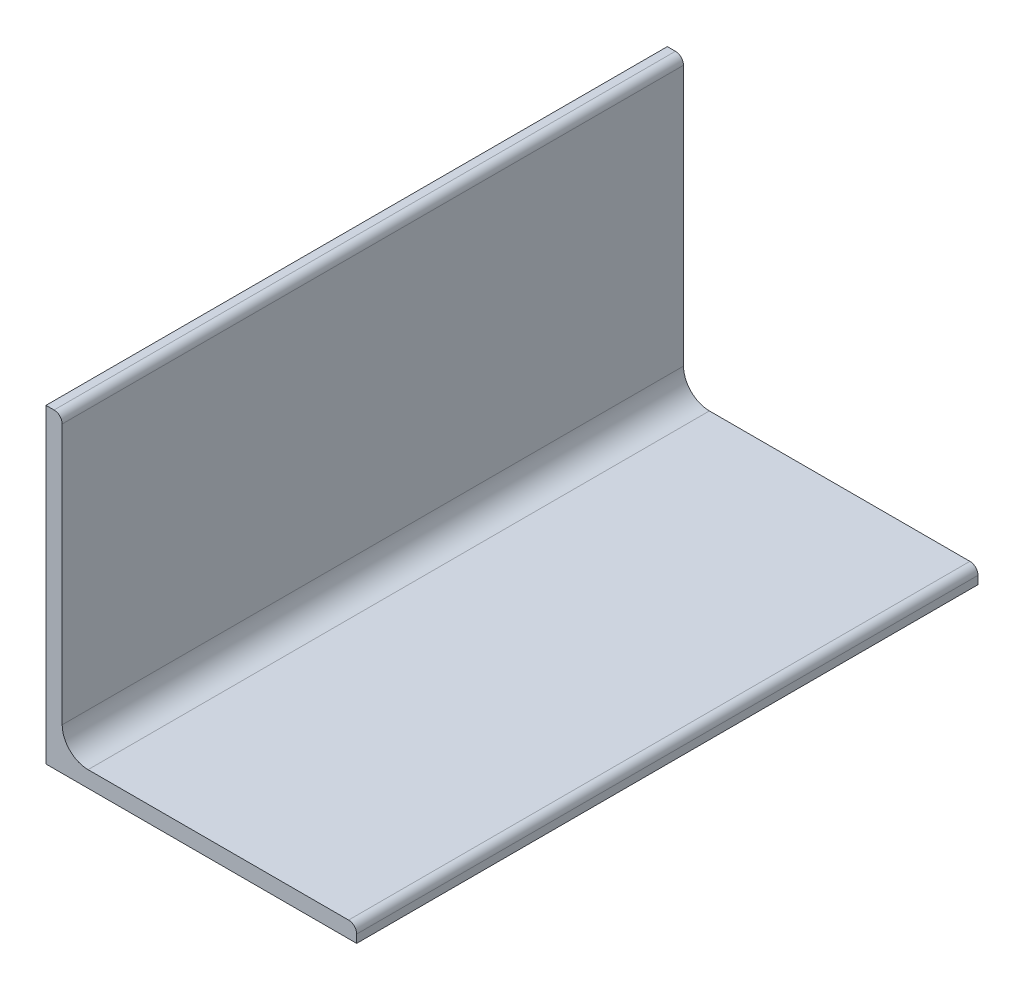
ISO-10303-21;
HEADER;
FILE_DESCRIPTION(('STEP AP214'),'2;1');
FILE_NAME('part.step','',(''),(''),'','','');
FILE_SCHEMA(('AUTOMOTIVE_DESIGN { 1 0 10303 214 1 1 1 1 }'));
ENDSEC;
DATA;
#1=APPLICATION_CONTEXT('core data for automotive mechanical design processes');
#2=APPLICATION_PROTOCOL_DEFINITION('international standard','automotive_design',2000,#1);
#3=PRODUCT_CONTEXT('',#1,'mechanical');
#4=PRODUCT('Part','Part','',(#3));
#5=PRODUCT_RELATED_PRODUCT_CATEGORY('part','',(#4));
#6=PRODUCT_DEFINITION_FORMATION('','',#4);
#7=PRODUCT_DEFINITION_CONTEXT('part definition',#1,'design');
#8=PRODUCT_DEFINITION('design','',#6,#7);
#9=PRODUCT_DEFINITION_SHAPE('','',#8);
#10=(LENGTH_UNIT() NAMED_UNIT(*) SI_UNIT(.MILLI.,.METRE.));
#11=(NAMED_UNIT(*) PLANE_ANGLE_UNIT() SI_UNIT($,.RADIAN.));
#12=(NAMED_UNIT(*) SI_UNIT($,.STERADIAN.) SOLID_ANGLE_UNIT());
#13=UNCERTAINTY_MEASURE_WITH_UNIT(LENGTH_MEASURE(1.E-05),#10,'distance_accuracy_value','');
#14=(GEOMETRIC_REPRESENTATION_CONTEXT(3) GLOBAL_UNCERTAINTY_ASSIGNED_CONTEXT((#13)) GLOBAL_UNIT_ASSIGNED_CONTEXT((#10,
#11,#12)) REPRESENTATION_CONTEXT('',''));
#15=CARTESIAN_POINT('',(0.,0.,0.));
#16=DIRECTION('',(0.,0.,1.));
#17=DIRECTION('',(1.,0.,0.));
#18=AXIS2_PLACEMENT_3D('',#15,#16,#17);
#19=CARTESIAN_POINT('',(0.425014111727251,152.925428131371,304.8));
#20=DIRECTION('',(1.,0.,0.));
#21=DIRECTION('',(0.,0.,-1.));
#22=AXIS2_PLACEMENT_3D('',#19,#20,#21);
#23=PLANE('',#22);
#24=DIRECTION('',(0.,-1.,0.));
#25=VECTOR('',#24,1.);
#26=CARTESIAN_POINT('',(0.425014111727251,152.925428131371,0.));
#27=LINE('',#26,#25);
#28=CARTESIAN_POINT('',(0.425014111727251,152.925428131371,0.));
#29=VERTEX_POINT('',#28);
#30=CARTESIAN_POINT('',(0.425014111727251,0.525428131371291,0.));
#31=VERTEX_POINT('',#30);
#32=EDGE_CURVE('E135',#29,#31,#27,.T.);
#33=ORIENTED_EDGE('',*,*,#32,.T.);
#34=DIRECTION('',(0.,0.,-1.));
#35=VECTOR('',#34,1.);
#36=CARTESIAN_POINT('',(0.425014111727251,0.525428131371291,304.8));
#37=LINE('',#36,#35);
#38=CARTESIAN_POINT('',(0.425014111727251,0.525428131371291,304.8));
#39=VERTEX_POINT('',#38);
#40=EDGE_CURVE('E11',#39,#31,#37,.T.);
#41=ORIENTED_EDGE('',*,*,#40,.F.);
#42=DIRECTION('',(0.,-1.,0.));
#43=VECTOR('',#42,1.);
#44=CARTESIAN_POINT('',(0.425014111727251,152.925428131371,304.8));
#45=LINE('',#44,#43);
#46=CARTESIAN_POINT('',(0.425014111727251,152.925428131371,304.8));
#47=VERTEX_POINT('',#46);
#48=EDGE_CURVE('E151',#47,#39,#45,.T.);
#49=ORIENTED_EDGE('',*,*,#48,.F.);
#50=DIRECTION('',(0.,0.,-1.));
#51=VECTOR('',#50,1.);
#52=CARTESIAN_POINT('',(0.425014111727251,152.925428131371,304.8));
#53=LINE('',#52,#51);
#54=EDGE_CURVE('E131',#47,#29,#53,.T.);
#55=ORIENTED_EDGE('',*,*,#54,.T.);
#56=EDGE_LOOP('',(#33,#41,#49,#55));
#57=FACE_BOUND('',#56,.T.);
#58=ADVANCED_FACE('F33',(#57),#23,.F.);
#59=CARTESIAN_POINT('',(0.425014111727251,0.525428131371291,304.8));
#60=DIRECTION('',(0.,1.,0.));
#61=DIRECTION('',(0.,0.,1.));
#62=AXIS2_PLACEMENT_3D('',#59,#60,#61);
#63=PLANE('',#62);
#64=DIRECTION('',(1.,0.,0.));
#65=VECTOR('',#64,1.);
#66=CARTESIAN_POINT('',(0.425014111727251,0.525428131371291,0.));
#67=LINE('',#66,#65);
#68=CARTESIAN_POINT('',(152.825014111727,0.525428131371291,0.));
#69=VERTEX_POINT('',#68);
#70=EDGE_CURVE('E138',#31,#69,#67,.T.);
#71=ORIENTED_EDGE('',*,*,#70,.T.);
#72=DIRECTION('',(0.,0.,-1.));
#73=VECTOR('',#72,1.);
#74=CARTESIAN_POINT('',(152.825014111727,0.525428131371291,304.8));
#75=LINE('',#74,#73);
#76=CARTESIAN_POINT('',(152.825014111727,0.525428131371291,304.8));
#77=VERTEX_POINT('',#76);
#78=EDGE_CURVE('E41',#77,#69,#75,.T.);
#79=ORIENTED_EDGE('',*,*,#78,.F.);
#80=DIRECTION('',(1.,0.,0.));
#81=VECTOR('',#80,1.);
#82=CARTESIAN_POINT('',(0.425014111727251,0.525428131371291,304.8));
#83=LINE('',#82,#81);
#84=EDGE_CURVE('E95',#39,#77,#83,.T.);
#85=ORIENTED_EDGE('',*,*,#84,.F.);
#86=ORIENTED_EDGE('',*,*,#40,.T.);
#87=EDGE_LOOP('',(#71,#79,#85,#86));
#88=FACE_BOUND('',#87,.T.);
#89=ADVANCED_FACE('F194',(#88),#63,.F.);
#90=CARTESIAN_POINT('',(152.825014111727,0.525428131371291,304.8));
#91=DIRECTION('',(-1.,0.,0.));
#92=DIRECTION('',(0.,0.,1.));
#93=AXIS2_PLACEMENT_3D('',#90,#91,#92);
#94=PLANE('',#93);
#95=DIRECTION('',(0.,1.,0.));
#96=VECTOR('',#95,1.);
#97=CARTESIAN_POINT('',(152.825014111727,0.525428131371291,0.));
#98=LINE('',#97,#96);
#99=CARTESIAN_POINT('',(152.825014111727,4.49417813137129,0.));
#100=VERTEX_POINT('',#99);
#101=EDGE_CURVE('E140',#69,#100,#98,.T.);
#102=ORIENTED_EDGE('',*,*,#101,.T.);
#103=DIRECTION('',(0.,0.,-1.));
#104=VECTOR('',#103,1.);
#105=CARTESIAN_POINT('',(152.825014111727,4.49417813137129,304.8));
#106=LINE('',#105,#104);
#107=CARTESIAN_POINT('',(152.825014111727,4.49417813137129,304.8));
#108=VERTEX_POINT('',#107);
#109=EDGE_CURVE('E161',#108,#100,#106,.T.);
#110=ORIENTED_EDGE('',*,*,#109,.F.);
#111=DIRECTION('',(0.,1.,0.));
#112=VECTOR('',#111,1.);
#113=CARTESIAN_POINT('',(152.825014111727,0.525428131371291,304.8));
#114=LINE('',#113,#112);
#115=EDGE_CURVE('E169',#77,#108,#114,.T.);
#116=ORIENTED_EDGE('',*,*,#115,.F.);
#117=ORIENTED_EDGE('',*,*,#78,.T.);
#118=EDGE_LOOP('',(#102,#110,#116,#117));
#119=FACE_BOUND('',#118,.T.);
#120=ADVANCED_FACE('F167',(#119),#94,.F.);
#121=CARTESIAN_POINT('',(148.856264111727,4.49417813137129,304.8));
#122=DIRECTION('',(0.,0.,-1.));
#123=DIRECTION('',(-1.,0.,0.));
#124=AXIS2_PLACEMENT_3D('',#121,#122,#123);
#125=CYLINDRICAL_SURFACE('',#124,3.96875);
#126=CARTESIAN_POINT('',(148.856264111727,4.49417813137129,0.));
#127=DIRECTION('',(0.,0.,1.));
#128=DIRECTION('',(1.,0.,0.));
#129=AXIS2_PLACEMENT_3D('',#126,#127,#128);
#130=CIRCLE('',#129,3.96875);
#131=CARTESIAN_POINT('',(148.856264111727,8.46292813137129,0.));
#132=VERTEX_POINT('',#131);
#133=EDGE_CURVE('E142',#100,#132,#130,.T.);
#134=ORIENTED_EDGE('',*,*,#133,.T.);
#135=DIRECTION('',(0.,0.,-1.));
#136=VECTOR('',#135,1.);
#137=CARTESIAN_POINT('',(148.856264111727,8.46292813137129,304.8));
#138=LINE('',#137,#136);
#139=CARTESIAN_POINT('',(148.856264111727,8.46292813137129,304.8));
#140=VERTEX_POINT('',#139);
#141=EDGE_CURVE('E158',#140,#132,#138,.T.);
#142=ORIENTED_EDGE('',*,*,#141,.F.);
#143=CARTESIAN_POINT('',(148.856264111727,4.49417813137129,304.8));
#144=DIRECTION('',(0.,0.,1.));
#145=DIRECTION('',(1.,0.,0.));
#146=AXIS2_PLACEMENT_3D('',#143,#144,#145);
#147=CIRCLE('',#146,3.96875);
#148=EDGE_CURVE('E185',#108,#140,#147,.T.);
#149=ORIENTED_EDGE('',*,*,#148,.F.);
#150=ORIENTED_EDGE('',*,*,#109,.T.);
#151=EDGE_LOOP('',(#134,#142,#149,#150));
#152=FACE_BOUND('',#151,.T.);
#153=ADVANCED_FACE('F178',(#152),#125,.T.);
#154=CARTESIAN_POINT('',(148.856264111727,8.46292813137129,304.8));
#155=DIRECTION('',(0.,-1.,0.));
#156=DIRECTION('',(0.,0.,-1.));
#157=AXIS2_PLACEMENT_3D('',#154,#155,#156);
#158=PLANE('',#157);
#159=DIRECTION('',(-1.,0.,0.));
#160=VECTOR('',#159,1.);
#161=CARTESIAN_POINT('',(148.856264111727,8.46292813137129,0.));
#162=LINE('',#161,#160);
#163=CARTESIAN_POINT('',(21.0625141117272,8.46292813137129,0.));
#164=VERTEX_POINT('',#163);
#165=EDGE_CURVE('E144',#132,#164,#162,.T.);
#166=ORIENTED_EDGE('',*,*,#165,.T.);
#167=DIRECTION('',(0.,0.,-1.));
#168=VECTOR('',#167,1.);
#169=CARTESIAN_POINT('',(21.0625141117272,8.46292813137129,304.8));
#170=LINE('',#169,#168);
#171=CARTESIAN_POINT('',(21.0625141117272,8.46292813137129,304.8));
#172=VERTEX_POINT('',#171);
#173=EDGE_CURVE('E155',#172,#164,#170,.T.);
#174=ORIENTED_EDGE('',*,*,#173,.F.);
#175=DIRECTION('',(-1.,0.,0.));
#176=VECTOR('',#175,1.);
#177=CARTESIAN_POINT('',(148.856264111727,8.46292813137129,304.8));
#178=LINE('',#177,#176);
#179=EDGE_CURVE('E184',#140,#172,#178,.T.);
#180=ORIENTED_EDGE('',*,*,#179,.F.);
#181=ORIENTED_EDGE('',*,*,#141,.T.);
#182=EDGE_LOOP('',(#166,#174,#180,#181));
#183=FACE_BOUND('',#182,.T.);
#184=ADVANCED_FACE('F182',(#183),#158,.F.);
#185=CARTESIAN_POINT('',(21.0625141117272,21.1629281313713,304.8));
#186=DIRECTION('',(0.,0.,-1.));
#187=DIRECTION('',(-1.,0.,0.));
#188=AXIS2_PLACEMENT_3D('',#185,#186,#187);
#189=CYLINDRICAL_SURFACE('',#188,12.7);
#190=CARTESIAN_POINT('',(21.0625141117272,21.1629281313713,0.));
#191=DIRECTION('',(0.,0.,-1.));
#192=DIRECTION('',(1.,0.,0.));
#193=AXIS2_PLACEMENT_3D('',#190,#191,#192);
#194=CIRCLE('',#193,12.7);
#195=CARTESIAN_POINT('',(8.36251411172725,21.1629281313713,0.));
#196=VERTEX_POINT('',#195);
#197=EDGE_CURVE('E146',#164,#196,#194,.T.);
#198=ORIENTED_EDGE('',*,*,#197,.T.);
#199=DIRECTION('',(0.,0.,-1.));
#200=VECTOR('',#199,1.);
#201=CARTESIAN_POINT('',(8.36251411172725,21.1629281313713,304.8));
#202=LINE('',#201,#200);
#203=CARTESIAN_POINT('',(8.36251411172725,21.1629281313713,304.8));
#204=VERTEX_POINT('',#203);
#205=EDGE_CURVE('E126',#204,#196,#202,.T.);
#206=ORIENTED_EDGE('',*,*,#205,.F.);
#207=CARTESIAN_POINT('',(21.0625141117272,21.1629281313713,304.8));
#208=DIRECTION('',(0.,0.,-1.));
#209=DIRECTION('',(1.,0.,0.));
#210=AXIS2_PLACEMENT_3D('',#207,#208,#209);
#211=CIRCLE('',#210,12.7);
#212=EDGE_CURVE('E117',#172,#204,#211,.T.);
#213=ORIENTED_EDGE('',*,*,#212,.F.);
#214=ORIENTED_EDGE('',*,*,#173,.T.);
#215=EDGE_LOOP('',(#198,#206,#213,#214));
#216=FACE_BOUND('',#215,.T.);
#217=ADVANCED_FACE('F206',(#216),#189,.F.);
#218=CARTESIAN_POINT('',(8.36251411172725,21.1629281313713,304.8));
#219=DIRECTION('',(-1.,0.,0.));
#220=DIRECTION('',(0.,0.,1.));
#221=AXIS2_PLACEMENT_3D('',#218,#219,#220);
#222=PLANE('',#221);
#223=DIRECTION('',(0.,1.,0.));
#224=VECTOR('',#223,1.);
#225=CARTESIAN_POINT('',(8.36251411172725,21.1629281313713,0.));
#226=LINE('',#225,#224);
#227=CARTESIAN_POINT('',(8.36251411172725,148.956678131371,0.));
#228=VERTEX_POINT('',#227);
#229=EDGE_CURVE('E125',#196,#228,#226,.T.);
#230=ORIENTED_EDGE('',*,*,#229,.T.);
#231=DIRECTION('',(0.,0.,-1.));
#232=VECTOR('',#231,1.);
#233=CARTESIAN_POINT('',(8.36251411172725,148.956678131371,304.8));
#234=LINE('',#233,#232);
#235=CARTESIAN_POINT('',(8.36251411172725,148.956678131371,304.8));
#236=VERTEX_POINT('',#235);
#237=EDGE_CURVE('E122',#236,#228,#234,.T.);
#238=ORIENTED_EDGE('',*,*,#237,.F.);
#239=DIRECTION('',(0.,1.,0.));
#240=VECTOR('',#239,1.);
#241=CARTESIAN_POINT('',(8.36251411172725,21.1629281313713,304.8));
#242=LINE('',#241,#240);
#243=EDGE_CURVE('E111',#204,#236,#242,.T.);
#244=ORIENTED_EDGE('',*,*,#243,.F.);
#245=ORIENTED_EDGE('',*,*,#205,.T.);
#246=EDGE_LOOP('',(#230,#238,#244,#245));
#247=FACE_BOUND('',#246,.T.);
#248=ADVANCED_FACE('F123',(#247),#222,.F.);
#249=CARTESIAN_POINT('',(4.39376411172725,148.956678131371,304.8));
#250=DIRECTION('',(0.,0.,-1.));
#251=DIRECTION('',(-1.,0.,0.));
#252=AXIS2_PLACEMENT_3D('',#249,#250,#251);
#253=CYLINDRICAL_SURFACE('',#252,3.96875);
#254=CARTESIAN_POINT('',(4.39376411172725,148.956678131371,0.));
#255=DIRECTION('',(0.,0.,1.));
#256=DIRECTION('',(1.,0.,0.));
#257=AXIS2_PLACEMENT_3D('',#254,#255,#256);
#258=CIRCLE('',#257,3.96875);
#259=CARTESIAN_POINT('',(4.39376411172725,152.925428131371,0.));
#260=VERTEX_POINT('',#259);
#261=EDGE_CURVE('E81',#228,#260,#258,.T.);
#262=ORIENTED_EDGE('',*,*,#261,.T.);
#263=DIRECTION('',(0.,0.,-1.));
#264=VECTOR('',#263,1.);
#265=CARTESIAN_POINT('',(4.39376411172725,152.925428131371,304.8));
#266=LINE('',#265,#264);
#267=CARTESIAN_POINT('',(4.39376411172725,152.925428131371,304.8));
#268=VERTEX_POINT('',#267);
#269=EDGE_CURVE('E127',#268,#260,#266,.T.);
#270=ORIENTED_EDGE('',*,*,#269,.F.);
#271=CARTESIAN_POINT('',(4.39376411172725,148.956678131371,304.8));
#272=DIRECTION('',(0.,0.,1.));
#273=DIRECTION('',(1.,0.,0.));
#274=AXIS2_PLACEMENT_3D('',#271,#272,#273);
#275=CIRCLE('',#274,3.96875);
#276=EDGE_CURVE('E115',#236,#268,#275,.T.);
#277=ORIENTED_EDGE('',*,*,#276,.F.);
#278=ORIENTED_EDGE('',*,*,#237,.T.);
#279=EDGE_LOOP('',(#262,#270,#277,#278));
#280=FACE_BOUND('',#279,.T.);
#281=ADVANCED_FACE('F129',(#280),#253,.T.);
#282=CARTESIAN_POINT('',(4.39376411172725,152.925428131371,304.8));
#283=DIRECTION('',(0.,-1.,0.));
#284=DIRECTION('',(0.,0.,-1.));
#285=AXIS2_PLACEMENT_3D('',#282,#283,#284);
#286=PLANE('',#285);
#287=DIRECTION('',(-1.,0.,0.));
#288=VECTOR('',#287,1.);
#289=CARTESIAN_POINT('',(4.39376411172725,152.925428131371,0.));
#290=LINE('',#289,#288);
#291=EDGE_CURVE('E87',#260,#29,#290,.T.);
#292=ORIENTED_EDGE('',*,*,#291,.T.);
#293=ORIENTED_EDGE('',*,*,#54,.F.);
#294=DIRECTION('',(-1.,0.,0.));
#295=VECTOR('',#294,1.);
#296=CARTESIAN_POINT('',(4.39376411172725,152.925428131371,304.8));
#297=LINE('',#296,#295);
#298=EDGE_CURVE('E49',#268,#47,#297,.T.);
#299=ORIENTED_EDGE('',*,*,#298,.F.);
#300=ORIENTED_EDGE('',*,*,#269,.T.);
#301=EDGE_LOOP('',(#292,#293,#299,#300));
#302=FACE_BOUND('',#301,.T.);
#303=ADVANCED_FACE('F214',(#302),#286,.F.);
#304=CARTESIAN_POINT('',(148.856264111727,4.49417813137129,304.8));
#305=DIRECTION('',(0.,0.,1.));
#306=DIRECTION('',(1.,0.,0.));
#307=AXIS2_PLACEMENT_3D('',#304,#305,#306);
#308=PLANE('',#307);
#309=ORIENTED_EDGE('',*,*,#48,.T.);
#310=ORIENTED_EDGE('',*,*,#84,.T.);
#311=ORIENTED_EDGE('',*,*,#115,.T.);
#312=ORIENTED_EDGE('',*,*,#148,.T.);
#313=ORIENTED_EDGE('',*,*,#179,.T.);
#314=ORIENTED_EDGE('',*,*,#212,.T.);
#315=ORIENTED_EDGE('',*,*,#243,.T.);
#316=ORIENTED_EDGE('',*,*,#276,.T.);
#317=ORIENTED_EDGE('',*,*,#298,.T.);
#318=EDGE_LOOP('',(#309,#310,#311,#312,#313,#314,#315,#316,#317));
#319=FACE_BOUND('',#318,.T.);
#320=ADVANCED_FACE('F113',(#319),#308,.T.);
#321=CARTESIAN_POINT('',(148.856264111727,4.49417813137129,0.));
#322=DIRECTION('',(0.,0.,1.));
#323=DIRECTION('',(1.,0.,0.));
#324=AXIS2_PLACEMENT_3D('',#321,#322,#323);
#325=PLANE('',#324);
#326=ORIENTED_EDGE('',*,*,#32,.F.);
#327=ORIENTED_EDGE('',*,*,#291,.F.);
#328=ORIENTED_EDGE('',*,*,#261,.F.);
#329=ORIENTED_EDGE('',*,*,#229,.F.);
#330=ORIENTED_EDGE('',*,*,#197,.F.);
#331=ORIENTED_EDGE('',*,*,#165,.F.);
#332=ORIENTED_EDGE('',*,*,#133,.F.);
#333=ORIENTED_EDGE('',*,*,#101,.F.);
#334=ORIENTED_EDGE('',*,*,#70,.F.);
#335=EDGE_LOOP('',(#326,#327,#328,#329,#330,#331,#332,#333,#334));
#336=FACE_BOUND('',#335,.T.);
#337=ADVANCED_FACE('F173',(#336),#325,.F.);
#338=CLOSED_SHELL('',(#58,#89,#120,#153,#184,#217,#248,#281,#303,#320,#337));
#339=MANIFOLD_SOLID_BREP('B2',#338);
#340=ADVANCED_BREP_SHAPE_REPRESENTATION('',(#18,#339),#14);
#341=SHAPE_DEFINITION_REPRESENTATION(#9,#340);
ENDSEC;
END-ISO-10303-21;
